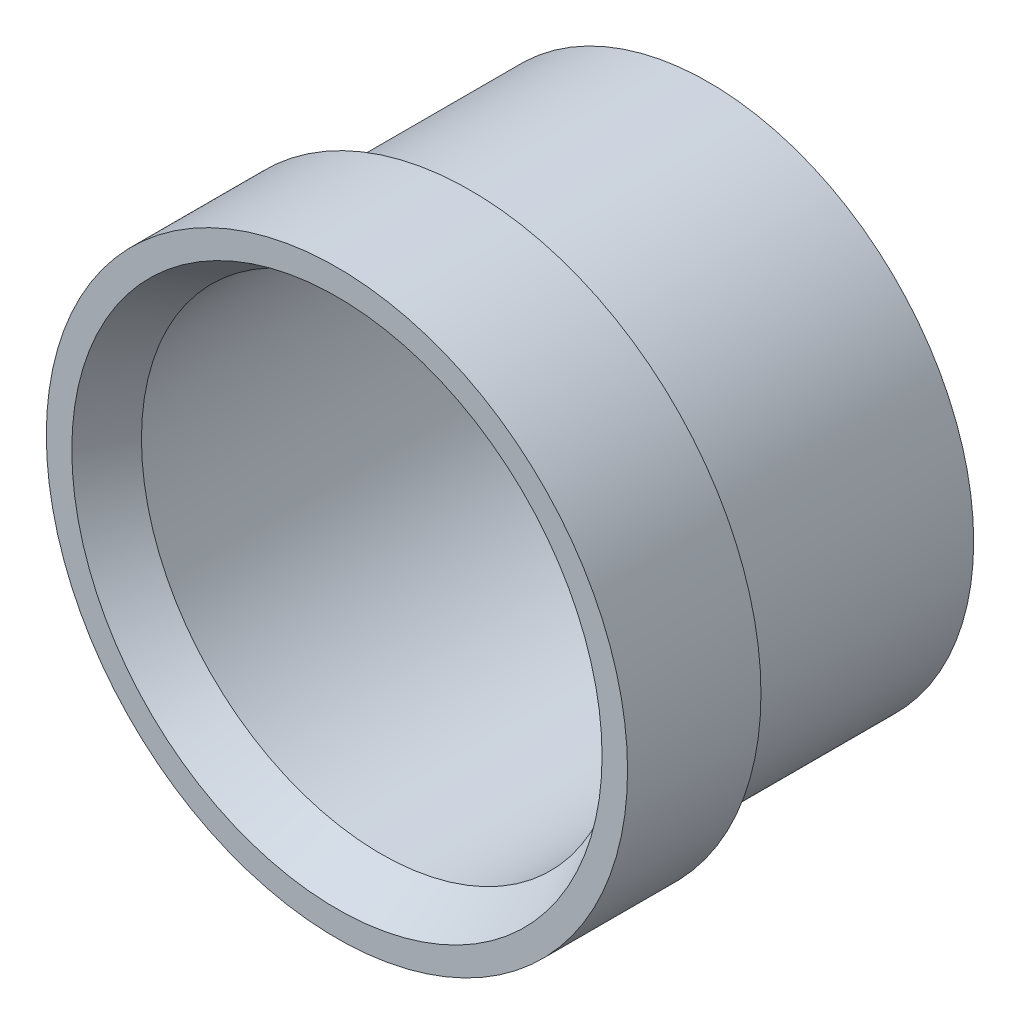
ISO-10303-21;
HEADER;
FILE_DESCRIPTION(('STEP AP214'),'2;1');
FILE_NAME('part.step','',(''),(''),'','','');
FILE_SCHEMA(('AUTOMOTIVE_DESIGN { 1 0 10303 214 1 1 1 1 }'));
ENDSEC;
DATA;
#1=APPLICATION_CONTEXT('core data for automotive mechanical design processes');
#2=APPLICATION_PROTOCOL_DEFINITION('international standard','automotive_design',2000,#1);
#3=PRODUCT_CONTEXT('',#1,'mechanical');
#4=PRODUCT('Part','Part','',(#3));
#5=PRODUCT_RELATED_PRODUCT_CATEGORY('part','',(#4));
#6=PRODUCT_DEFINITION_FORMATION('','',#4);
#7=PRODUCT_DEFINITION_CONTEXT('part definition',#1,'design');
#8=PRODUCT_DEFINITION('design','',#6,#7);
#9=PRODUCT_DEFINITION_SHAPE('','',#8);
#10=(LENGTH_UNIT() NAMED_UNIT(*) SI_UNIT(.MILLI.,.METRE.));
#11=(NAMED_UNIT(*) PLANE_ANGLE_UNIT() SI_UNIT($,.RADIAN.));
#12=(NAMED_UNIT(*) SI_UNIT($,.STERADIAN.) SOLID_ANGLE_UNIT());
#13=UNCERTAINTY_MEASURE_WITH_UNIT(LENGTH_MEASURE(1.E-05),#10,'distance_accuracy_value','');
#14=(GEOMETRIC_REPRESENTATION_CONTEXT(3) GLOBAL_UNCERTAINTY_ASSIGNED_CONTEXT((#13)) GLOBAL_UNIT_ASSIGNED_CONTEXT((#10,
#11,#12)) REPRESENTATION_CONTEXT('',''));
#15=CARTESIAN_POINT('',(0.,0.,0.));
#16=DIRECTION('',(0.,0.,1.));
#17=DIRECTION('',(1.,0.,0.));
#18=AXIS2_PLACEMENT_3D('',#15,#16,#17);
#19=CARTESIAN_POINT('',(0.,15.494,9.906));
#20=DIRECTION('',(0.,0.,1.));
#21=DIRECTION('',(1.,0.,0.));
#22=AXIS2_PLACEMENT_3D('',#19,#20,#21);
#23=PLANE('',#22);
#24=CARTESIAN_POINT('',(0.,0.,9.906));
#25=DIRECTION('',(0.,0.,-1.));
#26=DIRECTION('',(-1.,0.,0.));
#27=AXIS2_PLACEMENT_3D('',#24,#25,#26);
#28=CIRCLE('',#27,14.1351);
#29=CARTESIAN_POINT('',(-14.1351,0.,9.906));
#30=VERTEX_POINT('',#29);
#31=EDGE_CURVE('E58',#30,#30,#28,.T.);
#32=ORIENTED_EDGE('',*,*,#31,.T.);
#33=EDGE_LOOP('',(#32));
#34=FACE_BOUND('',#33,.T.);
#35=CARTESIAN_POINT('',(0.,0.,9.906));
#36=DIRECTION('',(0.,0.,-1.));
#37=DIRECTION('',(-1.,0.,0.));
#38=AXIS2_PLACEMENT_3D('',#35,#36,#37);
#39=CIRCLE('',#38,15.494);
#40=CARTESIAN_POINT('',(-15.494,0.,9.906));
#41=VERTEX_POINT('',#40);
#42=EDGE_CURVE('E10',#41,#41,#39,.T.);
#43=ORIENTED_EDGE('',*,*,#42,.F.);
#44=EDGE_LOOP('',(#43));
#45=FACE_BOUND('',#44,.T.);
#46=ADVANCED_FACE('F33',(#34,#45),#23,.T.);
#47=CARTESIAN_POINT('',(0.,0.,-9.906));
#48=DIRECTION('',(0.,0.,-1.));
#49=DIRECTION('',(-1.,0.,0.));
#50=AXIS2_PLACEMENT_3D('',#47,#48,#49);
#51=CYLINDRICAL_SURFACE('',#50,15.494);
#52=ORIENTED_EDGE('',*,*,#42,.T.);
#53=EDGE_LOOP('',(#52));
#54=FACE_BOUND('',#53,.T.);
#55=CARTESIAN_POINT('',(0.,0.,2.794));
#56=DIRECTION('',(0.,0.,-1.));
#57=DIRECTION('',(-1.,0.,0.));
#58=AXIS2_PLACEMENT_3D('',#55,#56,#57);
#59=CIRCLE('',#58,15.494);
#60=CARTESIAN_POINT('',(-15.494,0.,2.794));
#61=VERTEX_POINT('',#60);
#62=EDGE_CURVE('E39',#61,#61,#59,.T.);
#63=ORIENTED_EDGE('',*,*,#62,.F.);
#64=EDGE_LOOP('',(#63));
#65=FACE_BOUND('',#64,.T.);
#66=ADVANCED_FACE('F76',(#54,#65),#51,.T.);
#67=CARTESIAN_POINT('',(0.,14.1351,2.794));
#68=DIRECTION('',(0.,0.,-1.));
#69=DIRECTION('',(-1.,0.,0.));
#70=AXIS2_PLACEMENT_3D('',#67,#68,#69);
#71=PLANE('',#70);
#72=ORIENTED_EDGE('',*,*,#62,.T.);
#73=EDGE_LOOP('',(#72));
#74=FACE_BOUND('',#73,.T.);
#75=CARTESIAN_POINT('',(0.,0.,2.794));
#76=DIRECTION('',(0.,0.,-1.));
#77=DIRECTION('',(-1.,0.,0.));
#78=AXIS2_PLACEMENT_3D('',#75,#76,#77);
#79=CIRCLE('',#78,14.1351);
#80=CARTESIAN_POINT('',(-14.1351,0.,2.794));
#81=VERTEX_POINT('',#80);
#82=EDGE_CURVE('E43',#81,#81,#79,.T.);
#83=ORIENTED_EDGE('',*,*,#82,.F.);
#84=EDGE_LOOP('',(#83));
#85=FACE_BOUND('',#84,.T.);
#86=ADVANCED_FACE('F80',(#74,#85),#71,.T.);
#87=CARTESIAN_POINT('',(0.,0.,-9.906));
#88=DIRECTION('',(0.,0.,-1.));
#89=DIRECTION('',(-1.,0.,0.));
#90=AXIS2_PLACEMENT_3D('',#87,#88,#89);
#91=CYLINDRICAL_SURFACE('',#90,14.1351);
#92=ORIENTED_EDGE('',*,*,#82,.T.);
#93=EDGE_LOOP('',(#92));
#94=FACE_BOUND('',#93,.T.);
#95=CARTESIAN_POINT('',(0.,0.,-9.906));
#96=DIRECTION('',(0.,0.,-1.));
#97=DIRECTION('',(-1.,0.,0.));
#98=AXIS2_PLACEMENT_3D('',#95,#96,#97);
#99=CIRCLE('',#98,14.1351);
#100=CARTESIAN_POINT('',(-14.1351,0.,-9.906));
#101=VERTEX_POINT('',#100);
#102=EDGE_CURVE('E47',#101,#101,#99,.T.);
#103=ORIENTED_EDGE('',*,*,#102,.F.);
#104=EDGE_LOOP('',(#103));
#105=FACE_BOUND('',#104,.T.);
#106=ADVANCED_FACE('F84',(#94,#105),#91,.T.);
#107=CARTESIAN_POINT('',(0.,12.7762,-9.906));
#108=DIRECTION('',(0.,0.,-1.));
#109=DIRECTION('',(-1.,0.,0.));
#110=AXIS2_PLACEMENT_3D('',#107,#108,#109);
#111=PLANE('',#110);
#112=ORIENTED_EDGE('',*,*,#102,.T.);
#113=EDGE_LOOP('',(#112));
#114=FACE_BOUND('',#113,.T.);
#115=CARTESIAN_POINT('',(0.,0.,-9.906));
#116=DIRECTION('',(0.,0.,-1.));
#117=DIRECTION('',(-1.,0.,0.));
#118=AXIS2_PLACEMENT_3D('',#115,#116,#117);
#119=CIRCLE('',#118,12.7762);
#120=CARTESIAN_POINT('',(-12.7762,0.,-9.906));
#121=VERTEX_POINT('',#120);
#122=EDGE_CURVE('E52',#121,#121,#119,.T.);
#123=ORIENTED_EDGE('',*,*,#122,.F.);
#124=EDGE_LOOP('',(#123));
#125=FACE_BOUND('',#124,.T.);
#126=ADVANCED_FACE('F72',(#114,#125),#111,.T.);
#127=CARTESIAN_POINT('',(0.,0.,-9.906));
#128=DIRECTION('',(0.,0.,-1.));
#129=DIRECTION('',(-1.,0.,0.));
#130=AXIS2_PLACEMENT_3D('',#127,#128,#129);
#131=CYLINDRICAL_SURFACE('',#130,12.7762);
#132=ORIENTED_EDGE('',*,*,#122,.T.);
#133=EDGE_LOOP('',(#132));
#134=FACE_BOUND('',#133,.T.);
#135=CARTESIAN_POINT('',(0.,0.,7.55231615759466));
#136=DIRECTION('',(0.,0.,-1.));
#137=DIRECTION('',(-1.,0.,0.));
#138=AXIS2_PLACEMENT_3D('',#135,#136,#137);
#139=CIRCLE('',#138,12.7762);
#140=CARTESIAN_POINT('',(-12.7762,0.,7.55231615759466));
#141=VERTEX_POINT('',#140);
#142=EDGE_CURVE('E55',#141,#141,#139,.T.);
#143=ORIENTED_EDGE('',*,*,#142,.F.);
#144=EDGE_LOOP('',(#143));
#145=FACE_BOUND('',#144,.T.);
#146=ADVANCED_FACE('F66',(#134,#145),#131,.F.);
#147=CARTESIAN_POINT('',(0.,0.,9.906));
#148=DIRECTION('',(0.,0.,1.));
#149=DIRECTION('',(1.,0.,0.));
#150=AXIS2_PLACEMENT_3D('',#147,#148,#149);
#151=CONICAL_SURFACE('',#150,14.1351,0.5235987755983);
#152=ORIENTED_EDGE('',*,*,#142,.T.);
#153=EDGE_LOOP('',(#152));
#154=FACE_BOUND('',#153,.T.);
#155=ORIENTED_EDGE('',*,*,#31,.F.);
#156=EDGE_LOOP('',(#155));
#157=FACE_BOUND('',#156,.T.);
#158=ADVANCED_FACE('F64',(#154,#157),#151,.F.);
#159=CLOSED_SHELL('',(#46,#66,#86,#106,#126,#146,#158));
#160=MANIFOLD_SOLID_BREP('B2',#159);
#161=ADVANCED_BREP_SHAPE_REPRESENTATION('',(#18,#160),#14);
#162=SHAPE_DEFINITION_REPRESENTATION(#9,#161);
ENDSEC;
END-ISO-10303-21;
